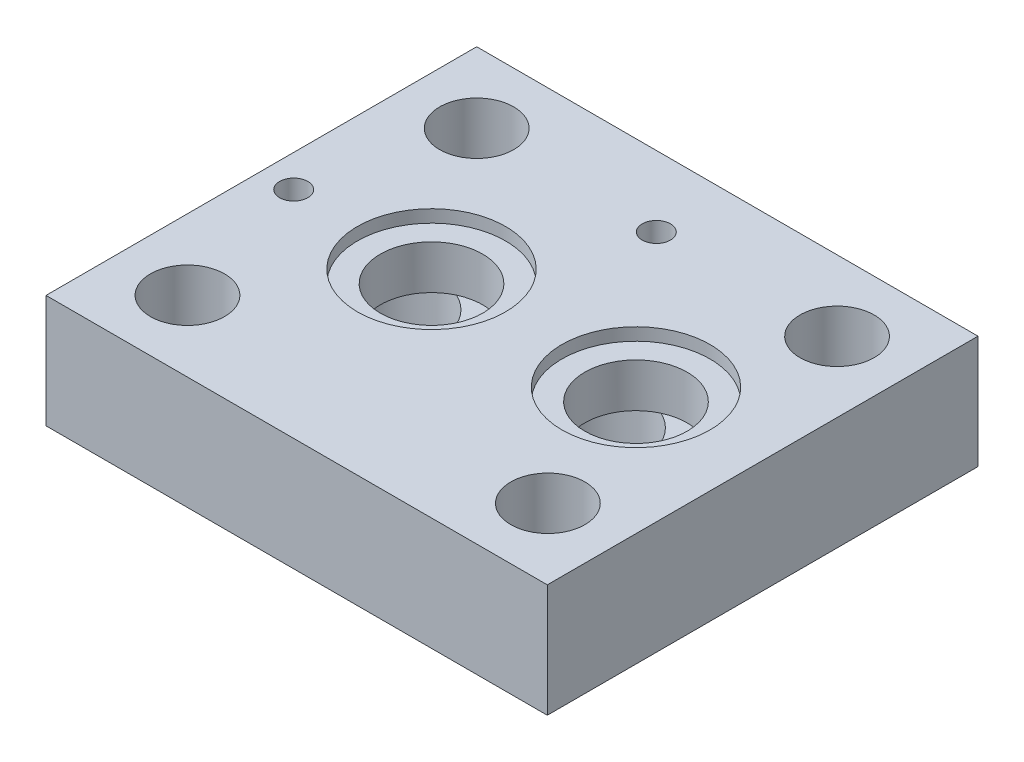
ISO-10303-21;
HEADER;
FILE_DESCRIPTION(('STEP AP214'),'2;1');
FILE_NAME('part.step','',(''),(''),'','','');
FILE_SCHEMA(('AUTOMOTIVE_DESIGN { 1 0 10303 214 1 1 1 1 }'));
ENDSEC;
DATA;
#1=APPLICATION_CONTEXT('core data for automotive mechanical design processes');
#2=APPLICATION_PROTOCOL_DEFINITION('international standard','automotive_design',2000,#1);
#3=PRODUCT_CONTEXT('',#1,'mechanical');
#4=PRODUCT('Part','Part','',(#3));
#5=PRODUCT_RELATED_PRODUCT_CATEGORY('part','',(#4));
#6=PRODUCT_DEFINITION_FORMATION('','',#4);
#7=PRODUCT_DEFINITION_CONTEXT('part definition',#1,'design');
#8=PRODUCT_DEFINITION('design','',#6,#7);
#9=PRODUCT_DEFINITION_SHAPE('','',#8);
#10=(LENGTH_UNIT() NAMED_UNIT(*) SI_UNIT(.MILLI.,.METRE.));
#11=(NAMED_UNIT(*) PLANE_ANGLE_UNIT() SI_UNIT($,.RADIAN.));
#12=(NAMED_UNIT(*) SI_UNIT($,.STERADIAN.) SOLID_ANGLE_UNIT());
#13=UNCERTAINTY_MEASURE_WITH_UNIT(LENGTH_MEASURE(1.E-05),#10,'distance_accuracy_value','');
#14=(GEOMETRIC_REPRESENTATION_CONTEXT(3) GLOBAL_UNCERTAINTY_ASSIGNED_CONTEXT((#13)) GLOBAL_UNIT_ASSIGNED_CONTEXT((#10,
#11,#12)) REPRESENTATION_CONTEXT('',''));
#15=CARTESIAN_POINT('',(0.,0.,0.));
#16=DIRECTION('',(0.,0.,1.));
#17=DIRECTION('',(1.,0.,0.));
#18=AXIS2_PLACEMENT_3D('',#15,#16,#17);
#19=CARTESIAN_POINT('',(27.84475,0.,-0.0317499999999993));
#20=DIRECTION('',(0.,1.,0.));
#21=DIRECTION('',(0.,0.,1.));
#22=AXIS2_PLACEMENT_3D('',#19,#20,#21);
#23=CYLINDRICAL_SURFACE('',#22,11.509375);
#24=CARTESIAN_POINT('',(27.84475,0.,-0.0317499999999993));
#25=DIRECTION('',(0.,1.,0.));
#26=DIRECTION('',(0.,0.,1.));
#27=AXIS2_PLACEMENT_3D('',#24,#25,#26);
#28=CIRCLE('',#27,11.509375);
#29=CARTESIAN_POINT('',(23.01875,0.,-10.4804550341478));
#30=VERTEX_POINT('',#29);
#31=CARTESIAN_POINT('',(23.01875,0.,10.4169550341478));
#32=VERTEX_POINT('',#31);
#33=EDGE_CURVE('E100',#30,#32,#28,.T.);
#34=ORIENTED_EDGE('',*,*,#33,.F.);
#35=EDGE_CURVE('E59',#32,#30,#28,.T.);
#36=ORIENTED_EDGE('',*,*,#35,.F.);
#37=EDGE_LOOP('',(#34,#36));
#38=FACE_BOUND('',#37,.T.);
#39=CARTESIAN_POINT('',(27.84475,9.8806,-0.0317499999999993));
#40=DIRECTION('',(0.,1.,0.));
#41=DIRECTION('',(0.,0.,1.));
#42=AXIS2_PLACEMENT_3D('',#39,#40,#41);
#43=CIRCLE('',#42,11.509375);
#44=CARTESIAN_POINT('',(27.84475,9.8806,11.477625));
#45=VERTEX_POINT('',#44);
#46=EDGE_CURVE('E47',#45,#45,#43,.F.);
#47=ORIENTED_EDGE('',*,*,#46,.F.);
#48=EDGE_LOOP('',(#47));
#49=FACE_BOUND('',#48,.T.);
#50=ADVANCED_FACE('F43',(#38,#49),#23,.F.);
#51=CARTESIAN_POINT('',(-18.12925,0.,-0.0317499999999993));
#52=DIRECTION('',(0.,1.,0.));
#53=DIRECTION('',(0.,0.,1.));
#54=AXIS2_PLACEMENT_3D('',#51,#52,#53);
#55=CYLINDRICAL_SURFACE('',#54,11.509375);
#56=CARTESIAN_POINT('',(-18.12925,0.,-0.0317499999999993));
#57=DIRECTION('',(0.,1.,0.));
#58=DIRECTION('',(0.,0.,1.));
#59=AXIS2_PLACEMENT_3D('',#56,#57,#58);
#60=CIRCLE('',#59,11.509375);
#61=CARTESIAN_POINT('',(-22.95525,0.,-10.4804550341478));
#62=VERTEX_POINT('',#61);
#63=CARTESIAN_POINT('',(-22.95525,0.,10.4169550341478));
#64=VERTEX_POINT('',#63);
#65=EDGE_CURVE('E109',#62,#64,#60,.T.);
#66=ORIENTED_EDGE('',*,*,#65,.F.);
#67=EDGE_CURVE('E66',#64,#62,#60,.T.);
#68=ORIENTED_EDGE('',*,*,#67,.F.);
#69=EDGE_LOOP('',(#66,#68));
#70=FACE_BOUND('',#69,.T.);
#71=CARTESIAN_POINT('',(-18.12925,9.8806,-0.0317499999999993));
#72=DIRECTION('',(0.,1.,0.));
#73=DIRECTION('',(0.,0.,1.));
#74=AXIS2_PLACEMENT_3D('',#71,#72,#73);
#75=CIRCLE('',#74,11.509375);
#76=CARTESIAN_POINT('',(-18.12925,9.8806,11.477625));
#77=VERTEX_POINT('',#76);
#78=EDGE_CURVE('E169',#77,#77,#75,.F.);
#79=ORIENTED_EDGE('',*,*,#78,.F.);
#80=EDGE_LOOP('',(#79));
#81=FACE_BOUND('',#80,.T.);
#82=ADVANCED_FACE('F207',(#70,#81),#55,.F.);
#83=CARTESIAN_POINT('',(56.35625,12.7,48.41875));
#84=DIRECTION('',(-1.,0.,0.));
#85=DIRECTION('',(0.,0.,1.));
#86=AXIS2_PLACEMENT_3D('',#83,#84,#85);
#87=PLANE('',#86);
#88=DIRECTION('',(0.,0.,-1.));
#89=VECTOR('',#88,1.);
#90=CARTESIAN_POINT('',(56.35625,-12.7,48.41875));
#91=LINE('',#90,#89);
#92=CARTESIAN_POINT('',(56.35625,-12.7,48.41875));
#93=VERTEX_POINT('',#92);
#94=CARTESIAN_POINT('',(56.35625,-12.7,-48.41875));
#95=VERTEX_POINT('',#94);
#96=EDGE_CURVE('E142',#93,#95,#91,.T.);
#97=ORIENTED_EDGE('',*,*,#96,.T.);
#98=DIRECTION('',(0.,-1.,0.));
#99=VECTOR('',#98,1.);
#100=CARTESIAN_POINT('',(56.35625,12.7,-48.41875));
#101=LINE('',#100,#99);
#102=CARTESIAN_POINT('',(56.35625,12.7,-48.41875));
#103=VERTEX_POINT('',#102);
#104=EDGE_CURVE('E11',#103,#95,#101,.T.);
#105=ORIENTED_EDGE('',*,*,#104,.F.);
#106=DIRECTION('',(0.,0.,-1.));
#107=VECTOR('',#106,1.);
#108=CARTESIAN_POINT('',(56.35625,12.7,48.41875));
#109=LINE('',#108,#107);
#110=CARTESIAN_POINT('',(56.35625,12.7,48.41875));
#111=VERTEX_POINT('',#110);
#112=EDGE_CURVE('E145',#111,#103,#109,.T.);
#113=ORIENTED_EDGE('',*,*,#112,.F.);
#114=DIRECTION('',(0.,-1.,0.));
#115=VECTOR('',#114,1.);
#116=CARTESIAN_POINT('',(56.35625,12.7,48.41875));
#117=LINE('',#116,#115);
#118=EDGE_CURVE('E155',#111,#93,#117,.T.);
#119=ORIENTED_EDGE('',*,*,#118,.T.);
#120=EDGE_LOOP('',(#97,#105,#113,#119));
#121=FACE_BOUND('',#120,.T.);
#122=ADVANCED_FACE('F45',(#121),#87,.F.);
#123=CARTESIAN_POINT('',(-56.35625,12.7,-48.41875));
#124=DIRECTION('',(0.,0.,1.));
#125=DIRECTION('',(1.,0.,0.));
#126=AXIS2_PLACEMENT_3D('',#123,#124,#125);
#127=PLANE('',#126);
#128=DIRECTION('',(-1.,0.,0.));
#129=VECTOR('',#128,1.);
#130=CARTESIAN_POINT('',(-56.35625,-12.7,-48.41875));
#131=LINE('',#130,#129);
#132=CARTESIAN_POINT('',(-56.35625,-12.7,-48.41875));
#133=VERTEX_POINT('',#132);
#134=EDGE_CURVE('E158',#95,#133,#131,.T.);
#135=ORIENTED_EDGE('',*,*,#134,.T.);
#136=DIRECTION('',(0.,-1.,0.));
#137=VECTOR('',#136,1.);
#138=CARTESIAN_POINT('',(-56.35625,12.7,-48.41875));
#139=LINE('',#138,#137);
#140=CARTESIAN_POINT('',(-56.35625,12.7,-48.41875));
#141=VERTEX_POINT('',#140);
#142=EDGE_CURVE('E52',#141,#133,#139,.T.);
#143=ORIENTED_EDGE('',*,*,#142,.F.);
#144=DIRECTION('',(-1.,0.,0.));
#145=VECTOR('',#144,1.);
#146=CARTESIAN_POINT('',(-56.35625,12.7,-48.41875));
#147=LINE('',#146,#145);
#148=EDGE_CURVE('E148',#103,#141,#147,.T.);
#149=ORIENTED_EDGE('',*,*,#148,.F.);
#150=ORIENTED_EDGE('',*,*,#104,.T.);
#151=EDGE_LOOP('',(#135,#143,#149,#150));
#152=FACE_BOUND('',#151,.T.);
#153=ADVANCED_FACE('F216',(#152),#127,.F.);
#154=CARTESIAN_POINT('',(-56.35625,12.7,48.41875));
#155=DIRECTION('',(1.,0.,0.));
#156=DIRECTION('',(0.,0.,-1.));
#157=AXIS2_PLACEMENT_3D('',#154,#155,#156);
#158=PLANE('',#157);
#159=DIRECTION('',(0.,0.,1.));
#160=VECTOR('',#159,1.);
#161=CARTESIAN_POINT('',(-56.35625,-12.7,48.41875));
#162=LINE('',#161,#160);
#163=CARTESIAN_POINT('',(-56.35625,-12.7,48.41875));
#164=VERTEX_POINT('',#163);
#165=EDGE_CURVE('E160',#133,#164,#162,.T.);
#166=ORIENTED_EDGE('',*,*,#165,.T.);
#167=DIRECTION('',(0.,-1.,0.));
#168=VECTOR('',#167,1.);
#169=CARTESIAN_POINT('',(-56.35625,12.7,48.41875));
#170=LINE('',#169,#168);
#171=CARTESIAN_POINT('',(-56.35625,12.7,48.41875));
#172=VERTEX_POINT('',#171);
#173=EDGE_CURVE('E165',#172,#164,#170,.T.);
#174=ORIENTED_EDGE('',*,*,#173,.F.);
#175=DIRECTION('',(0.,0.,1.));
#176=VECTOR('',#175,1.);
#177=CARTESIAN_POINT('',(-56.35625,12.7,48.41875));
#178=LINE('',#177,#176);
#179=EDGE_CURVE('E151',#141,#172,#178,.T.);
#180=ORIENTED_EDGE('',*,*,#179,.F.);
#181=ORIENTED_EDGE('',*,*,#142,.T.);
#182=EDGE_LOOP('',(#166,#174,#180,#181));
#183=FACE_BOUND('',#182,.T.);
#184=ADVANCED_FACE('F260',(#183),#158,.F.);
#185=CARTESIAN_POINT('',(-56.35625,12.7,48.41875));
#186=DIRECTION('',(0.,0.,-1.));
#187=DIRECTION('',(-1.,0.,0.));
#188=AXIS2_PLACEMENT_3D('',#185,#186,#187);
#189=PLANE('',#188);
#190=DIRECTION('',(1.,0.,0.));
#191=VECTOR('',#190,1.);
#192=CARTESIAN_POINT('',(-56.35625,-12.7,48.41875));
#193=LINE('',#192,#191);
#194=EDGE_CURVE('E149',#164,#93,#193,.T.);
#195=ORIENTED_EDGE('',*,*,#194,.T.);
#196=ORIENTED_EDGE('',*,*,#118,.F.);
#197=DIRECTION('',(1.,0.,0.));
#198=VECTOR('',#197,1.);
#199=CARTESIAN_POINT('',(-56.35625,12.7,48.41875));
#200=LINE('',#199,#198);
#201=EDGE_CURVE('E153',#172,#111,#200,.T.);
#202=ORIENTED_EDGE('',*,*,#201,.F.);
#203=ORIENTED_EDGE('',*,*,#173,.T.);
#204=EDGE_LOOP('',(#195,#196,#202,#203));
#205=FACE_BOUND('',#204,.T.);
#206=ADVANCED_FACE('F253',(#205),#189,.F.);
#207=CARTESIAN_POINT('',(0.,12.7,0.));
#208=DIRECTION('',(0.,-1.,0.));
#209=DIRECTION('',(0.,0.,-1.));
#210=AXIS2_PLACEMENT_3D('',#207,#208,#209);
#211=PLANE('',#210);
#212=CARTESIAN_POINT('',(-49.11725,12.7,-0.0317499999999993));
#213=DIRECTION('',(0.,1.,0.));
#214=DIRECTION('',(0.,0.,1.));
#215=AXIS2_PLACEMENT_3D('',#212,#213,#214);
#216=CIRCLE('',#215,3.175);
#217=CARTESIAN_POINT('',(-49.11725,12.7,3.14325));
#218=VERTEX_POINT('',#217);
#219=EDGE_CURVE('E504',#218,#218,#216,.T.);
#220=ORIENTED_EDGE('',*,*,#219,.F.);
#221=EDGE_LOOP('',(#220));
#222=FACE_BOUND('',#221,.T.);
#223=CARTESIAN_POINT('',(-0.0952500000000036,12.7,-32.54375));
#224=DIRECTION('',(0.,1.,0.));
#225=DIRECTION('',(0.,0.,1.));
#226=AXIS2_PLACEMENT_3D('',#223,#224,#225);
#227=CIRCLE('',#226,3.175);
#228=CARTESIAN_POINT('',(-0.0952500000000036,12.7,-29.36875));
#229=VERTEX_POINT('',#228);
#230=EDGE_CURVE('E509',#229,#229,#227,.T.);
#231=ORIENTED_EDGE('',*,*,#230,.F.);
#232=EDGE_LOOP('',(#231));
#233=FACE_BOUND('',#232,.T.);
#234=CARTESIAN_POINT('',(-18.12925,12.7,-0.0317499999999993));
#235=DIRECTION('',(0.,1.,0.));
#236=DIRECTION('',(0.,0.,1.));
#237=AXIS2_PLACEMENT_3D('',#234,#235,#236);
#238=CIRCLE('',#237,16.6497);
#239=CARTESIAN_POINT('',(-18.12925,12.7,16.61795));
#240=VERTEX_POINT('',#239);
#241=EDGE_CURVE('E176',#240,#240,#238,.T.);
#242=ORIENTED_EDGE('',*,*,#241,.F.);
#243=EDGE_LOOP('',(#242));
#244=FACE_BOUND('',#243,.T.);
#245=CARTESIAN_POINT('',(27.84475,12.7,-0.0317499999999993));
#246=DIRECTION('',(0.,1.,0.));
#247=DIRECTION('',(0.,0.,1.));
#248=AXIS2_PLACEMENT_3D('',#245,#246,#247);
#249=CIRCLE('',#248,16.6497);
#250=CARTESIAN_POINT('',(27.84475,12.7,16.61795));
#251=VERTEX_POINT('',#250);
#252=EDGE_CURVE('E181',#251,#251,#249,.T.);
#253=ORIENTED_EDGE('',*,*,#252,.F.);
#254=EDGE_LOOP('',(#253));
#255=FACE_BOUND('',#254,.T.);
#256=CARTESIAN_POINT('',(40.54475,12.7,32.48025));
#257=DIRECTION('',(0.,1.,0.));
#258=DIRECTION('',(0.,0.,1.));
#259=AXIS2_PLACEMENT_3D('',#256,#257,#258);
#260=CIRCLE('',#259,8.334375);
#261=CARTESIAN_POINT('',(40.54475,12.7,40.814625));
#262=VERTEX_POINT('',#261);
#263=EDGE_CURVE('E131',#262,#262,#260,.T.);
#264=ORIENTED_EDGE('',*,*,#263,.F.);
#265=EDGE_LOOP('',(#264));
#266=FACE_BOUND('',#265,.T.);
#267=CARTESIAN_POINT('',(-40.48125,12.7,-32.54375));
#268=DIRECTION('',(0.,1.,0.));
#269=DIRECTION('',(0.,0.,1.));
#270=AXIS2_PLACEMENT_3D('',#267,#268,#269);
#271=CIRCLE('',#270,8.334375);
#272=CARTESIAN_POINT('',(-40.48125,12.7,-24.209375));
#273=VERTEX_POINT('',#272);
#274=EDGE_CURVE('E122',#273,#273,#271,.T.);
#275=ORIENTED_EDGE('',*,*,#274,.F.);
#276=EDGE_LOOP('',(#275));
#277=FACE_BOUND('',#276,.T.);
#278=CARTESIAN_POINT('',(40.54475,12.7,-32.54375));
#279=DIRECTION('',(0.,1.,0.));
#280=DIRECTION('',(0.,0.,1.));
#281=AXIS2_PLACEMENT_3D('',#278,#279,#280);
#282=CIRCLE('',#281,8.334375);
#283=CARTESIAN_POINT('',(40.54475,12.7,-24.209375));
#284=VERTEX_POINT('',#283);
#285=EDGE_CURVE('E123',#284,#284,#282,.T.);
#286=ORIENTED_EDGE('',*,*,#285,.F.);
#287=EDGE_LOOP('',(#286));
#288=FACE_BOUND('',#287,.T.);
#289=CARTESIAN_POINT('',(-40.48125,12.7,32.48025));
#290=DIRECTION('',(0.,1.,0.));
#291=DIRECTION('',(0.,0.,1.));
#292=AXIS2_PLACEMENT_3D('',#289,#290,#291);
#293=CIRCLE('',#292,8.334375);
#294=CARTESIAN_POINT('',(-40.48125,12.7,40.814625));
#295=VERTEX_POINT('',#294);
#296=EDGE_CURVE('E139',#295,#295,#293,.T.);
#297=ORIENTED_EDGE('',*,*,#296,.F.);
#298=EDGE_LOOP('',(#297));
#299=FACE_BOUND('',#298,.T.);
#300=ORIENTED_EDGE('',*,*,#112,.T.);
#301=ORIENTED_EDGE('',*,*,#148,.T.);
#302=ORIENTED_EDGE('',*,*,#179,.T.);
#303=ORIENTED_EDGE('',*,*,#201,.T.);
#304=EDGE_LOOP('',(#300,#301,#302,#303));
#305=FACE_BOUND('',#304,.T.);
#306=ADVANCED_FACE('F250',(#222,#233,#244,#255,#266,#277,#288,#299,#305),#211,.F.);
#307=CARTESIAN_POINT('',(0.,-12.7,0.));
#308=DIRECTION('',(0.,-1.,0.));
#309=DIRECTION('',(0.,0.,-1.));
#310=AXIS2_PLACEMENT_3D('',#307,#308,#309);
#311=PLANE('',#310);
#312=CARTESIAN_POINT('',(49.18075,-12.7,-0.0317499999999993));
#313=DIRECTION('',(0.,1.,0.));
#314=DIRECTION('',(0.,0.,1.));
#315=AXIS2_PLACEMENT_3D('',#312,#313,#314);
#316=CIRCLE('',#315,3.571875);
#317=CARTESIAN_POINT('',(49.18075,-12.7,3.540125));
#318=VERTEX_POINT('',#317);
#319=EDGE_CURVE('E519',#318,#318,#316,.T.);
#320=ORIENTED_EDGE('',*,*,#319,.T.);
#321=EDGE_LOOP('',(#320));
#322=FACE_BOUND('',#321,.T.);
#323=CARTESIAN_POINT('',(0.158749999999991,-12.7,32.48025));
#324=DIRECTION('',(0.,1.,0.));
#325=DIRECTION('',(0.,0.,1.));
#326=AXIS2_PLACEMENT_3D('',#323,#324,#325);
#327=CIRCLE('',#326,3.571875);
#328=CARTESIAN_POINT('',(0.158749999999991,-12.7,36.052125));
#329=VERTEX_POINT('',#328);
#330=EDGE_CURVE('E507',#329,#329,#327,.T.);
#331=ORIENTED_EDGE('',*,*,#330,.T.);
#332=EDGE_LOOP('',(#331));
#333=FACE_BOUND('',#332,.T.);
#334=CARTESIAN_POINT('',(-27.78125,-12.7,-0.0317499999999993));
#335=DIRECTION('',(0.,1.,0.));
#336=DIRECTION('',(0.,0.,1.));
#337=AXIS2_PLACEMENT_3D('',#334,#335,#336);
#338=CIRCLE('',#337,11.509375);
#339=CARTESIAN_POINT('',(-27.78125,-12.7,11.477625));
#340=VERTEX_POINT('',#339);
#341=EDGE_CURVE('E115',#340,#340,#338,.T.);
#342=ORIENTED_EDGE('',*,*,#341,.T.);
#343=EDGE_LOOP('',(#342));
#344=FACE_BOUND('',#343,.T.);
#345=CARTESIAN_POINT('',(18.19275,-12.7,-0.0317499999999993));
#346=DIRECTION('',(0.,1.,0.));
#347=DIRECTION('',(0.,0.,1.));
#348=AXIS2_PLACEMENT_3D('',#345,#346,#347);
#349=CIRCLE('',#348,11.509375);
#350=CARTESIAN_POINT('',(18.19275,-12.7,11.477625));
#351=VERTEX_POINT('',#350);
#352=EDGE_CURVE('E113',#351,#351,#349,.T.);
#353=ORIENTED_EDGE('',*,*,#352,.T.);
#354=EDGE_LOOP('',(#353));
#355=FACE_BOUND('',#354,.T.);
#356=CARTESIAN_POINT('',(40.54475,-12.7,32.48025));
#357=DIRECTION('',(0.,1.,0.));
#358=DIRECTION('',(0.,0.,1.));
#359=AXIS2_PLACEMENT_3D('',#356,#357,#358);
#360=CIRCLE('',#359,8.334375);
#361=CARTESIAN_POINT('',(40.54475,-12.7,40.814625));
#362=VERTEX_POINT('',#361);
#363=EDGE_CURVE('E127',#362,#362,#360,.T.);
#364=ORIENTED_EDGE('',*,*,#363,.T.);
#365=EDGE_LOOP('',(#364));
#366=FACE_BOUND('',#365,.T.);
#367=CARTESIAN_POINT('',(-40.48125,-12.7,-32.54375));
#368=DIRECTION('',(0.,1.,0.));
#369=DIRECTION('',(0.,0.,1.));
#370=AXIS2_PLACEMENT_3D('',#367,#368,#369);
#371=CIRCLE('',#370,8.334375);
#372=CARTESIAN_POINT('',(-40.48125,-12.7,-24.209375));
#373=VERTEX_POINT('',#372);
#374=EDGE_CURVE('E134',#373,#373,#371,.T.);
#375=ORIENTED_EDGE('',*,*,#374,.T.);
#376=EDGE_LOOP('',(#375));
#377=FACE_BOUND('',#376,.T.);
#378=CARTESIAN_POINT('',(40.54475,-12.7,-32.54375));
#379=DIRECTION('',(0.,1.,0.));
#380=DIRECTION('',(0.,0.,1.));
#381=AXIS2_PLACEMENT_3D('',#378,#379,#380);
#382=CIRCLE('',#381,8.334375);
#383=CARTESIAN_POINT('',(40.54475,-12.7,-24.209375));
#384=VERTEX_POINT('',#383);
#385=EDGE_CURVE('E119',#384,#384,#382,.T.);
#386=ORIENTED_EDGE('',*,*,#385,.T.);
#387=EDGE_LOOP('',(#386));
#388=FACE_BOUND('',#387,.T.);
#389=CARTESIAN_POINT('',(-40.48125,-12.7,32.48025));
#390=DIRECTION('',(0.,1.,0.));
#391=DIRECTION('',(0.,0.,1.));
#392=AXIS2_PLACEMENT_3D('',#389,#390,#391);
#393=CIRCLE('',#392,8.334375);
#394=CARTESIAN_POINT('',(-40.48125,-12.7,40.814625));
#395=VERTEX_POINT('',#394);
#396=EDGE_CURVE('E130',#395,#395,#393,.T.);
#397=ORIENTED_EDGE('',*,*,#396,.T.);
#398=EDGE_LOOP('',(#397));
#399=FACE_BOUND('',#398,.T.);
#400=ORIENTED_EDGE('',*,*,#96,.F.);
#401=ORIENTED_EDGE('',*,*,#194,.F.);
#402=ORIENTED_EDGE('',*,*,#165,.F.);
#403=ORIENTED_EDGE('',*,*,#134,.F.);
#404=EDGE_LOOP('',(#400,#401,#402,#403));
#405=FACE_BOUND('',#404,.T.);
#406=ADVANCED_FACE('F248',(#322,#333,#344,#355,#366,#377,#388,#399,#405),#311,.T.);
#407=CARTESIAN_POINT('',(-40.48125,12.7,32.48025));
#408=DIRECTION('',(0.,-1.,0.));
#409=DIRECTION('',(0.,0.,-1.));
#410=AXIS2_PLACEMENT_3D('',#407,#408,#409);
#411=CYLINDRICAL_SURFACE('',#410,8.334375);
#412=ORIENTED_EDGE('',*,*,#296,.T.);
#413=EDGE_LOOP('',(#412));
#414=FACE_BOUND('',#413,.T.);
#415=ORIENTED_EDGE('',*,*,#396,.F.);
#416=EDGE_LOOP('',(#415));
#417=FACE_BOUND('',#416,.T.);
#418=ADVANCED_FACE('F238',(#414,#417),#411,.F.);
#419=CARTESIAN_POINT('',(40.54475,12.7,-32.54375));
#420=DIRECTION('',(0.,-1.,0.));
#421=DIRECTION('',(0.,0.,-1.));
#422=AXIS2_PLACEMENT_3D('',#419,#420,#421);
#423=CYLINDRICAL_SURFACE('',#422,8.334375);
#424=ORIENTED_EDGE('',*,*,#285,.T.);
#425=EDGE_LOOP('',(#424));
#426=FACE_BOUND('',#425,.T.);
#427=ORIENTED_EDGE('',*,*,#385,.F.);
#428=EDGE_LOOP('',(#427));
#429=FACE_BOUND('',#428,.T.);
#430=ADVANCED_FACE('F234',(#426,#429),#423,.F.);
#431=CARTESIAN_POINT('',(-40.48125,12.7,-32.54375));
#432=DIRECTION('',(0.,-1.,0.));
#433=DIRECTION('',(0.,0.,-1.));
#434=AXIS2_PLACEMENT_3D('',#431,#432,#433);
#435=CYLINDRICAL_SURFACE('',#434,8.334375);
#436=ORIENTED_EDGE('',*,*,#274,.T.);
#437=EDGE_LOOP('',(#436));
#438=FACE_BOUND('',#437,.T.);
#439=ORIENTED_EDGE('',*,*,#374,.F.);
#440=EDGE_LOOP('',(#439));
#441=FACE_BOUND('',#440,.T.);
#442=ADVANCED_FACE('F237',(#438,#441),#435,.F.);
#443=CARTESIAN_POINT('',(40.54475,12.7,32.48025));
#444=DIRECTION('',(0.,-1.,0.));
#445=DIRECTION('',(0.,0.,-1.));
#446=AXIS2_PLACEMENT_3D('',#443,#444,#445);
#447=CYLINDRICAL_SURFACE('',#446,8.334375);
#448=ORIENTED_EDGE('',*,*,#263,.T.);
#449=EDGE_LOOP('',(#448));
#450=FACE_BOUND('',#449,.T.);
#451=ORIENTED_EDGE('',*,*,#363,.F.);
#452=EDGE_LOOP('',(#451));
#453=FACE_BOUND('',#452,.T.);
#454=ADVANCED_FACE('F231',(#450,#453),#447,.F.);
#455=CARTESIAN_POINT('',(18.19275,0.,-0.0317499999999993));
#456=DIRECTION('',(0.,-1.,0.));
#457=DIRECTION('',(0.,0.,-1.));
#458=AXIS2_PLACEMENT_3D('',#455,#456,#457);
#459=CYLINDRICAL_SURFACE('',#458,11.509375);
#460=CARTESIAN_POINT('',(18.19275,0.,-0.0317499999999993));
#461=DIRECTION('',(0.,1.,0.));
#462=DIRECTION('',(0.,0.,1.));
#463=AXIS2_PLACEMENT_3D('',#460,#461,#462);
#464=CIRCLE('',#463,11.509375);
#465=EDGE_CURVE('E98',#32,#30,#464,.T.);
#466=ORIENTED_EDGE('',*,*,#465,.T.);
#467=EDGE_CURVE('E106',#30,#32,#464,.T.);
#468=ORIENTED_EDGE('',*,*,#467,.T.);
#469=EDGE_LOOP('',(#466,#468));
#470=FACE_BOUND('',#469,.T.);
#471=ORIENTED_EDGE('',*,*,#352,.F.);
#472=EDGE_LOOP('',(#471));
#473=FACE_BOUND('',#472,.T.);
#474=ADVANCED_FACE('F111',(#470,#473),#459,.F.);
#475=CARTESIAN_POINT('',(18.19275,0.,-0.0317499999999993));
#476=DIRECTION('',(0.,1.,0.));
#477=DIRECTION('',(0.,0.,1.));
#478=AXIS2_PLACEMENT_3D('',#475,#476,#477);
#479=PLANE('',#478);
#480=ORIENTED_EDGE('',*,*,#467,.F.);
#481=ORIENTED_EDGE('',*,*,#33,.T.);
#482=EDGE_LOOP('',(#480,#481));
#483=FACE_BOUND('',#482,.T.);
#484=ADVANCED_FACE('F107',(#483),#479,.F.);
#485=CARTESIAN_POINT('',(-27.78125,0.,-0.0317499999999993));
#486=DIRECTION('',(0.,-1.,0.));
#487=DIRECTION('',(0.,0.,-1.));
#488=AXIS2_PLACEMENT_3D('',#485,#486,#487);
#489=CYLINDRICAL_SURFACE('',#488,11.509375);
#490=CARTESIAN_POINT('',(-27.78125,0.,-0.0317499999999993));
#491=DIRECTION('',(0.,1.,0.));
#492=DIRECTION('',(0.,0.,1.));
#493=AXIS2_PLACEMENT_3D('',#490,#491,#492);
#494=CIRCLE('',#493,11.509375);
#495=EDGE_CURVE('E126',#64,#62,#494,.T.);
#496=ORIENTED_EDGE('',*,*,#495,.T.);
#497=EDGE_CURVE('E196',#62,#64,#494,.T.);
#498=ORIENTED_EDGE('',*,*,#497,.T.);
#499=EDGE_LOOP('',(#496,#498));
#500=FACE_BOUND('',#499,.T.);
#501=ORIENTED_EDGE('',*,*,#341,.F.);
#502=EDGE_LOOP('',(#501));
#503=FACE_BOUND('',#502,.T.);
#504=ADVANCED_FACE('F203',(#500,#503),#489,.F.);
#505=CARTESIAN_POINT('',(-27.78125,0.,-0.0317499999999993));
#506=DIRECTION('',(0.,1.,0.));
#507=DIRECTION('',(0.,0.,1.));
#508=AXIS2_PLACEMENT_3D('',#505,#506,#507);
#509=PLANE('',#508);
#510=ORIENTED_EDGE('',*,*,#497,.F.);
#511=ORIENTED_EDGE('',*,*,#65,.T.);
#512=EDGE_LOOP('',(#510,#511));
#513=FACE_BOUND('',#512,.T.);
#514=ADVANCED_FACE('F206',(#513),#509,.F.);
#515=CARTESIAN_POINT('',(27.84475,0.,-0.0317499999999993));
#516=DIRECTION('',(0.,1.,0.));
#517=DIRECTION('',(0.,0.,1.));
#518=AXIS2_PLACEMENT_3D('',#515,#516,#517);
#519=PLANE('',#518);
#520=ORIENTED_EDGE('',*,*,#35,.T.);
#521=ORIENTED_EDGE('',*,*,#465,.F.);
#522=EDGE_LOOP('',(#520,#521));
#523=FACE_BOUND('',#522,.T.);
#524=ADVANCED_FACE('F96',(#523),#519,.T.);
#525=CARTESIAN_POINT('',(-18.12925,0.,-0.0317499999999993));
#526=DIRECTION('',(0.,1.,0.));
#527=DIRECTION('',(0.,0.,1.));
#528=AXIS2_PLACEMENT_3D('',#525,#526,#527);
#529=PLANE('',#528);
#530=ORIENTED_EDGE('',*,*,#67,.T.);
#531=ORIENTED_EDGE('',*,*,#495,.F.);
#532=EDGE_LOOP('',(#530,#531));
#533=FACE_BOUND('',#532,.T.);
#534=ADVANCED_FACE('F220',(#533),#529,.T.);
#535=CARTESIAN_POINT('',(-18.12925,9.8806,-0.0317499999999993));
#536=DIRECTION('',(0.,1.,0.));
#537=DIRECTION('',(0.,0.,1.));
#538=AXIS2_PLACEMENT_3D('',#535,#536,#537);
#539=PLANE('',#538);
#540=CARTESIAN_POINT('',(-18.12925,9.8806,-0.0317499999999993));
#541=DIRECTION('',(0.,1.,0.));
#542=DIRECTION('',(0.,0.,1.));
#543=AXIS2_PLACEMENT_3D('',#540,#541,#542);
#544=CIRCLE('',#543,16.6497);
#545=CARTESIAN_POINT('',(-18.12925,9.8806,16.61795));
#546=VERTEX_POINT('',#545);
#547=EDGE_CURVE('E171',#546,#546,#544,.T.);
#548=ORIENTED_EDGE('',*,*,#547,.T.);
#549=EDGE_LOOP('',(#548));
#550=FACE_BOUND('',#549,.T.);
#551=ORIENTED_EDGE('',*,*,#78,.T.);
#552=EDGE_LOOP('',(#551));
#553=FACE_BOUND('',#552,.T.);
#554=ADVANCED_FACE('F345',(#550,#553),#539,.T.);
#555=CARTESIAN_POINT('',(-18.12925,9.8806,-0.0317499999999993));
#556=DIRECTION('',(0.,1.,0.));
#557=DIRECTION('',(0.,0.,1.));
#558=AXIS2_PLACEMENT_3D('',#555,#556,#557);
#559=CYLINDRICAL_SURFACE('',#558,16.6497);
#560=ORIENTED_EDGE('',*,*,#547,.F.);
#561=EDGE_LOOP('',(#560));
#562=FACE_BOUND('',#561,.T.);
#563=ORIENTED_EDGE('',*,*,#241,.T.);
#564=EDGE_LOOP('',(#563));
#565=FACE_BOUND('',#564,.T.);
#566=ADVANCED_FACE('F362',(#562,#565),#559,.F.);
#567=CARTESIAN_POINT('',(27.84475,9.8806,-0.0317499999999993));
#568=DIRECTION('',(0.,1.,0.));
#569=DIRECTION('',(0.,0.,1.));
#570=AXIS2_PLACEMENT_3D('',#567,#568,#569);
#571=PLANE('',#570);
#572=CARTESIAN_POINT('',(27.84475,9.8806,-0.0317499999999993));
#573=DIRECTION('',(0.,1.,0.));
#574=DIRECTION('',(0.,0.,1.));
#575=AXIS2_PLACEMENT_3D('',#572,#573,#574);
#576=CIRCLE('',#575,16.6497);
#577=CARTESIAN_POINT('',(27.84475,9.8806,16.61795));
#578=VERTEX_POINT('',#577);
#579=EDGE_CURVE('E189',#578,#578,#576,.T.);
#580=ORIENTED_EDGE('',*,*,#579,.T.);
#581=EDGE_LOOP('',(#580));
#582=FACE_BOUND('',#581,.T.);
#583=ORIENTED_EDGE('',*,*,#46,.T.);
#584=EDGE_LOOP('',(#583));
#585=FACE_BOUND('',#584,.T.);
#586=ADVANCED_FACE('F370',(#582,#585),#571,.T.);
#587=CARTESIAN_POINT('',(27.84475,9.8806,-0.0317499999999993));
#588=DIRECTION('',(0.,1.,0.));
#589=DIRECTION('',(0.,0.,1.));
#590=AXIS2_PLACEMENT_3D('',#587,#588,#589);
#591=CYLINDRICAL_SURFACE('',#590,16.6497);
#592=ORIENTED_EDGE('',*,*,#579,.F.);
#593=EDGE_LOOP('',(#592));
#594=FACE_BOUND('',#593,.T.);
#595=ORIENTED_EDGE('',*,*,#252,.T.);
#596=EDGE_LOOP('',(#595));
#597=FACE_BOUND('',#596,.T.);
#598=ADVANCED_FACE('F379',(#594,#597),#591,.F.);
#599=CARTESIAN_POINT('',(0.158749999999991,-4.7625,32.48025));
#600=DIRECTION('',(0.,-1.,0.));
#601=DIRECTION('',(0.,0.,-1.));
#602=AXIS2_PLACEMENT_3D('',#599,#600,#601);
#603=CYLINDRICAL_SURFACE('',#602,3.571875);
#604=CARTESIAN_POINT('',(0.158749999999991,-4.7625,32.48025));
#605=DIRECTION('',(0.,1.,0.));
#606=DIRECTION('',(0.,0.,1.));
#607=AXIS2_PLACEMENT_3D('',#604,#605,#606);
#608=CIRCLE('',#607,3.571875);
#609=CARTESIAN_POINT('',(0.158749999999991,-4.7625,36.052125));
#610=VERTEX_POINT('',#609);
#611=EDGE_CURVE('E184',#610,#610,#608,.T.);
#612=ORIENTED_EDGE('',*,*,#611,.T.);
#613=EDGE_LOOP('',(#612));
#614=FACE_BOUND('',#613,.T.);
#615=ORIENTED_EDGE('',*,*,#330,.F.);
#616=EDGE_LOOP('',(#615));
#617=FACE_BOUND('',#616,.T.);
#618=ADVANCED_FACE('F387',(#614,#617),#603,.F.);
#619=CARTESIAN_POINT('',(0.158749999999991,-4.7625,32.48025));
#620=DIRECTION('',(0.,1.,0.));
#621=DIRECTION('',(0.,0.,1.));
#622=AXIS2_PLACEMENT_3D('',#619,#620,#621);
#623=PLANE('',#622);
#624=ORIENTED_EDGE('',*,*,#611,.F.);
#625=EDGE_LOOP('',(#624));
#626=FACE_BOUND('',#625,.T.);
#627=ADVANCED_FACE('F396',(#626),#623,.F.);
#628=CARTESIAN_POINT('',(49.18075,-4.7625,-0.0317499999999993));
#629=DIRECTION('',(0.,-1.,0.));
#630=DIRECTION('',(0.,0.,-1.));
#631=AXIS2_PLACEMENT_3D('',#628,#629,#630);
#632=CYLINDRICAL_SURFACE('',#631,3.571875);
#633=CARTESIAN_POINT('',(49.18075,-4.7625,-0.0317499999999993));
#634=DIRECTION('',(0.,1.,0.));
#635=DIRECTION('',(0.,0.,1.));
#636=AXIS2_PLACEMENT_3D('',#633,#634,#635);
#637=CIRCLE('',#636,3.571875);
#638=CARTESIAN_POINT('',(49.18075,-4.7625,3.540125));
#639=VERTEX_POINT('',#638);
#640=EDGE_CURVE('E192',#639,#639,#637,.T.);
#641=ORIENTED_EDGE('',*,*,#640,.T.);
#642=EDGE_LOOP('',(#641));
#643=FACE_BOUND('',#642,.T.);
#644=ORIENTED_EDGE('',*,*,#319,.F.);
#645=EDGE_LOOP('',(#644));
#646=FACE_BOUND('',#645,.T.);
#647=ADVANCED_FACE('F405',(#643,#646),#632,.F.);
#648=CARTESIAN_POINT('',(49.18075,-4.7625,-0.0317499999999993));
#649=DIRECTION('',(0.,1.,0.));
#650=DIRECTION('',(0.,0.,1.));
#651=AXIS2_PLACEMENT_3D('',#648,#649,#650);
#652=PLANE('',#651);
#653=ORIENTED_EDGE('',*,*,#640,.F.);
#654=EDGE_LOOP('',(#653));
#655=FACE_BOUND('',#654,.T.);
#656=ADVANCED_FACE('F414',(#655),#652,.F.);
#657=CARTESIAN_POINT('',(-0.0952500000000036,4.7625,-32.54375));
#658=DIRECTION('',(0.,1.,0.));
#659=DIRECTION('',(0.,0.,1.));
#660=AXIS2_PLACEMENT_3D('',#657,#658,#659);
#661=CYLINDRICAL_SURFACE('',#660,3.175);
#662=CARTESIAN_POINT('',(-0.0952500000000036,4.7625,-32.54375));
#663=DIRECTION('',(0.,1.,0.));
#664=DIRECTION('',(0.,0.,1.));
#665=AXIS2_PLACEMENT_3D('',#662,#663,#664);
#666=CIRCLE('',#665,3.175);
#667=CARTESIAN_POINT('',(-0.0952500000000036,4.7625,-29.36875));
#668=VERTEX_POINT('',#667);
#669=EDGE_CURVE('E514',#668,#668,#666,.T.);
#670=ORIENTED_EDGE('',*,*,#669,.F.);
#671=EDGE_LOOP('',(#670));
#672=FACE_BOUND('',#671,.T.);
#673=ORIENTED_EDGE('',*,*,#230,.T.);
#674=EDGE_LOOP('',(#673));
#675=FACE_BOUND('',#674,.T.);
#676=ADVANCED_FACE('F423',(#672,#675),#661,.F.);
#677=CARTESIAN_POINT('',(-0.0952500000000036,4.7625,-32.54375));
#678=DIRECTION('',(0.,1.,0.));
#679=DIRECTION('',(0.,0.,1.));
#680=AXIS2_PLACEMENT_3D('',#677,#678,#679);
#681=PLANE('',#680);
#682=ORIENTED_EDGE('',*,*,#669,.T.);
#683=EDGE_LOOP('',(#682));
#684=FACE_BOUND('',#683,.T.);
#685=ADVANCED_FACE('F432',(#684),#681,.T.);
#686=CARTESIAN_POINT('',(-49.11725,4.7625,-0.0317499999999993));
#687=DIRECTION('',(0.,1.,0.));
#688=DIRECTION('',(0.,0.,1.));
#689=AXIS2_PLACEMENT_3D('',#686,#687,#688);
#690=CYLINDRICAL_SURFACE('',#689,3.175);
#691=CARTESIAN_POINT('',(-49.11725,4.7625,-0.0317499999999993));
#692=DIRECTION('',(0.,1.,0.));
#693=DIRECTION('',(0.,0.,1.));
#694=AXIS2_PLACEMENT_3D('',#691,#692,#693);
#695=CIRCLE('',#694,3.175);
#696=CARTESIAN_POINT('',(-49.11725,4.7625,3.14325));
#697=VERTEX_POINT('',#696);
#698=EDGE_CURVE('E503',#697,#697,#695,.T.);
#699=ORIENTED_EDGE('',*,*,#698,.F.);
#700=EDGE_LOOP('',(#699));
#701=FACE_BOUND('',#700,.T.);
#702=ORIENTED_EDGE('',*,*,#219,.T.);
#703=EDGE_LOOP('',(#702));
#704=FACE_BOUND('',#703,.T.);
#705=ADVANCED_FACE('F441',(#701,#704),#690,.F.);
#706=CARTESIAN_POINT('',(-49.11725,4.7625,-0.0317499999999993));
#707=DIRECTION('',(0.,1.,0.));
#708=DIRECTION('',(0.,0.,1.));
#709=AXIS2_PLACEMENT_3D('',#706,#707,#708);
#710=PLANE('',#709);
#711=ORIENTED_EDGE('',*,*,#698,.T.);
#712=EDGE_LOOP('',(#711));
#713=FACE_BOUND('',#712,.T.);
#714=ADVANCED_FACE('F450',(#713),#710,.T.);
#715=CLOSED_SHELL('',(#50,#82,#122,#153,#184,#206,#306,#406,#418,#430,#442,#454,#474,#484,#504,
#514,#524,#534,#554,#566,#586,#598,#618,#627,#647,#656,#676,#685,#705,#714));
#716=MANIFOLD_SOLID_BREP('B2',#715);
#717=ADVANCED_BREP_SHAPE_REPRESENTATION('',(#18,#716),#14);
#718=SHAPE_DEFINITION_REPRESENTATION(#9,#717);
ENDSEC;
END-ISO-10303-21;
